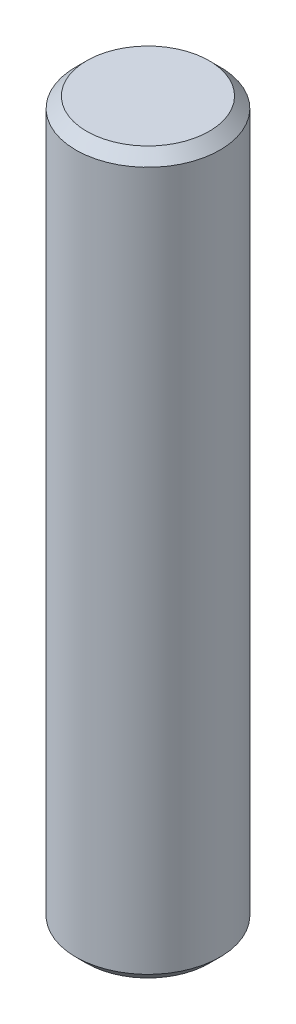
ISO-10303-21;
HEADER;
FILE_DESCRIPTION(('STEP AP214'),'2;1');
FILE_NAME('part.step','',(''),(''),'','','');
FILE_SCHEMA(('AUTOMOTIVE_DESIGN { 1 0 10303 214 1 1 1 1 }'));
ENDSEC;
DATA;
#1=APPLICATION_CONTEXT('core data for automotive mechanical design processes');
#2=APPLICATION_PROTOCOL_DEFINITION('international standard','automotive_design',2000,#1);
#3=PRODUCT_CONTEXT('',#1,'mechanical');
#4=PRODUCT('Part','Part','',(#3));
#5=PRODUCT_RELATED_PRODUCT_CATEGORY('part','',(#4));
#6=PRODUCT_DEFINITION_FORMATION('','',#4);
#7=PRODUCT_DEFINITION_CONTEXT('part definition',#1,'design');
#8=PRODUCT_DEFINITION('design','',#6,#7);
#9=PRODUCT_DEFINITION_SHAPE('','',#8);
#10=(LENGTH_UNIT() NAMED_UNIT(*) SI_UNIT(.MILLI.,.METRE.));
#11=(NAMED_UNIT(*) PLANE_ANGLE_UNIT() SI_UNIT($,.RADIAN.));
#12=(NAMED_UNIT(*) SI_UNIT($,.STERADIAN.) SOLID_ANGLE_UNIT());
#13=UNCERTAINTY_MEASURE_WITH_UNIT(LENGTH_MEASURE(1.E-05),#10,'distance_accuracy_value','');
#14=(GEOMETRIC_REPRESENTATION_CONTEXT(3) GLOBAL_UNCERTAINTY_ASSIGNED_CONTEXT((#13)) GLOBAL_UNIT_ASSIGNED_CONTEXT((#10,
#11,#12)) REPRESENTATION_CONTEXT('',''));
#15=CARTESIAN_POINT('',(0.,0.,0.));
#16=DIRECTION('',(0.,0.,1.));
#17=DIRECTION('',(1.,0.,0.));
#18=AXIS2_PLACEMENT_3D('',#15,#16,#17);
#19=CARTESIAN_POINT('',(0.,20.,0.));
#20=DIRECTION('',(0.,-1.,0.));
#21=DIRECTION('',(0.,0.,-1.));
#22=AXIS2_PLACEMENT_3D('',#19,#20,#21);
#23=CYLINDRICAL_SURFACE('',#22,2.);
#24=CARTESIAN_POINT('',(0.,19.7,0.));
#25=DIRECTION('',(0.,1.,0.));
#26=DIRECTION('',(0.,0.,1.));
#27=AXIS2_PLACEMENT_3D('',#24,#25,#26);
#28=CIRCLE('',#27,2.);
#29=CARTESIAN_POINT('',(0.,19.7,2.));
#30=VERTEX_POINT('',#29);
#31=EDGE_CURVE('E43',#30,#30,#28,.F.);
#32=ORIENTED_EDGE('',*,*,#31,.T.);
#33=EDGE_LOOP('',(#32));
#34=FACE_BOUND('',#33,.T.);
#35=CARTESIAN_POINT('',(0.,0.299999999999995,0.));
#36=DIRECTION('',(0.,1.,0.));
#37=DIRECTION('',(0.,0.,1.));
#38=AXIS2_PLACEMENT_3D('',#35,#36,#37);
#39=CIRCLE('',#38,2.);
#40=CARTESIAN_POINT('',(0.,0.299999999999995,2.));
#41=VERTEX_POINT('',#40);
#42=EDGE_CURVE('E47',#41,#41,#39,.T.);
#43=ORIENTED_EDGE('',*,*,#42,.T.);
#44=EDGE_LOOP('',(#43));
#45=FACE_BOUND('',#44,.T.);
#46=ADVANCED_FACE('F35',(#34,#45),#23,.T.);
#47=CARTESIAN_POINT('',(0.,20.,0.));
#48=DIRECTION('',(0.,1.,0.));
#49=DIRECTION('',(0.,0.,1.));
#50=AXIS2_PLACEMENT_3D('',#47,#48,#49);
#51=PLANE('',#50);
#52=CARTESIAN_POINT('',(0.,20.,0.));
#53=DIRECTION('',(0.,1.,0.));
#54=DIRECTION('',(0.,0.,1.));
#55=AXIS2_PLACEMENT_3D('',#52,#53,#54);
#56=CIRCLE('',#55,1.69999999999999);
#57=CARTESIAN_POINT('',(0.,20.,1.69999999999999));
#58=VERTEX_POINT('',#57);
#59=EDGE_CURVE('E51',#58,#58,#56,.T.);
#60=ORIENTED_EDGE('',*,*,#59,.T.);
#61=EDGE_LOOP('',(#60));
#62=FACE_BOUND('',#61,.T.);
#63=ADVANCED_FACE('F57',(#62),#51,.T.);
#64=CARTESIAN_POINT('',(0.,0.,0.));
#65=DIRECTION('',(0.,1.,0.));
#66=DIRECTION('',(0.,0.,1.));
#67=AXIS2_PLACEMENT_3D('',#64,#65,#66);
#68=PLANE('',#67);
#69=CARTESIAN_POINT('',(0.,0.,0.));
#70=DIRECTION('',(0.,1.,0.));
#71=DIRECTION('',(0.,0.,1.));
#72=AXIS2_PLACEMENT_3D('',#69,#70,#71);
#73=CIRCLE('',#72,1.7);
#74=CARTESIAN_POINT('',(0.,0.,1.7));
#75=VERTEX_POINT('',#74);
#76=EDGE_CURVE('E10',#75,#75,#73,.F.);
#77=ORIENTED_EDGE('',*,*,#76,.T.);
#78=EDGE_LOOP('',(#77));
#79=FACE_BOUND('',#78,.T.);
#80=ADVANCED_FACE('F61',(#79),#68,.F.);
#81=CARTESIAN_POINT('',(0.,20.,0.));
#82=DIRECTION('',(0.,-1.,0.));
#83=DIRECTION('',(0.,0.,-1.));
#84=AXIS2_PLACEMENT_3D('',#81,#82,#83);
#85=CONICAL_SURFACE('',#84,1.69999999999999,0.785398163397445);
#86=ORIENTED_EDGE('',*,*,#31,.F.);
#87=EDGE_LOOP('',(#86));
#88=FACE_BOUND('',#87,.T.);
#89=ORIENTED_EDGE('',*,*,#59,.F.);
#90=EDGE_LOOP('',(#89));
#91=FACE_BOUND('',#90,.T.);
#92=ADVANCED_FACE('F59',(#88,#91),#85,.T.);
#93=CARTESIAN_POINT('',(0.,0.299999999999995,0.));
#94=DIRECTION('',(0.,1.,0.));
#95=DIRECTION('',(0.,0.,1.));
#96=AXIS2_PLACEMENT_3D('',#93,#94,#95);
#97=CONICAL_SURFACE('',#96,2.,0.785398163397451);
#98=ORIENTED_EDGE('',*,*,#76,.F.);
#99=EDGE_LOOP('',(#98));
#100=FACE_BOUND('',#99,.T.);
#101=ORIENTED_EDGE('',*,*,#42,.F.);
#102=EDGE_LOOP('',(#101));
#103=FACE_BOUND('',#102,.T.);
#104=ADVANCED_FACE('F38',(#100,#103),#97,.T.);
#105=CLOSED_SHELL('',(#46,#63,#80,#92,#104));
#106=MANIFOLD_SOLID_BREP('B2',#105);
#107=ADVANCED_BREP_SHAPE_REPRESENTATION('',(#18,#106),#14);
#108=SHAPE_DEFINITION_REPRESENTATION(#9,#107);
ENDSEC;
END-ISO-10303-21;
